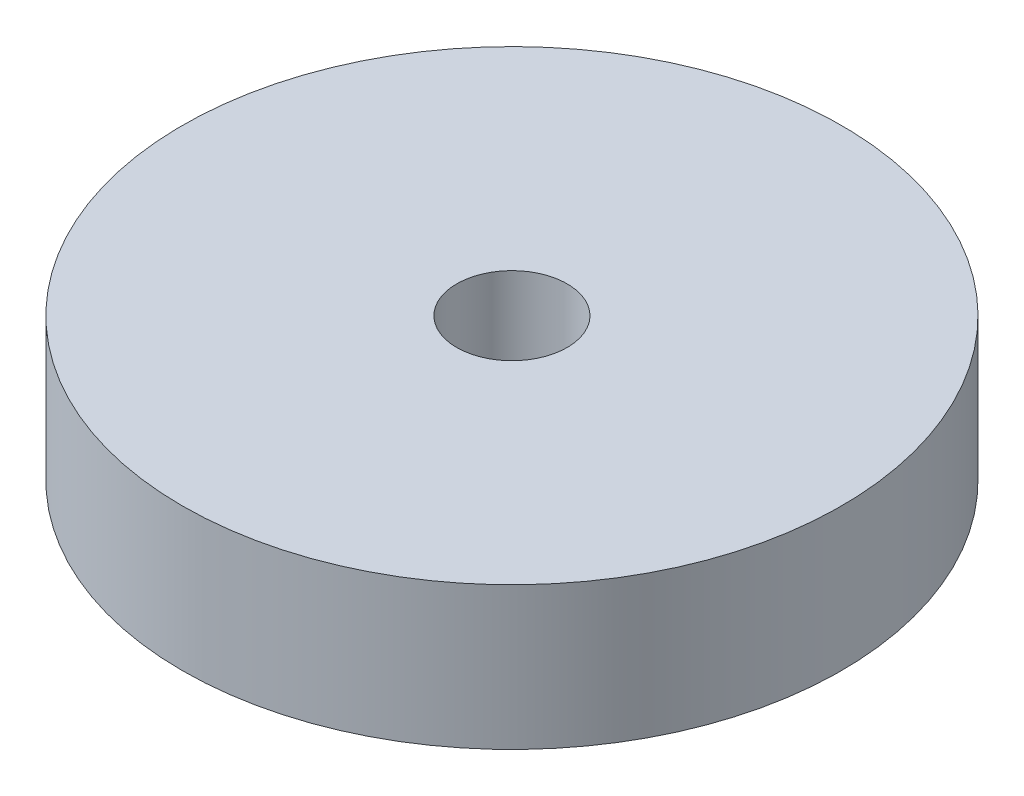
ISO-10303-21;
HEADER;
FILE_DESCRIPTION(('STEP AP214'),'2;1');
FILE_NAME('part.step','',(''),(''),'','','');
FILE_SCHEMA(('AUTOMOTIVE_DESIGN { 1 0 10303 214 1 1 1 1 }'));
ENDSEC;
DATA;
#1=APPLICATION_CONTEXT('core data for automotive mechanical design processes');
#2=APPLICATION_PROTOCOL_DEFINITION('international standard','automotive_design',2000,#1);
#3=PRODUCT_CONTEXT('',#1,'mechanical');
#4=PRODUCT('Part','Part','',(#3));
#5=PRODUCT_RELATED_PRODUCT_CATEGORY('part','',(#4));
#6=PRODUCT_DEFINITION_FORMATION('','',#4);
#7=PRODUCT_DEFINITION_CONTEXT('part definition',#1,'design');
#8=PRODUCT_DEFINITION('design','',#6,#7);
#9=PRODUCT_DEFINITION_SHAPE('','',#8);
#10=(LENGTH_UNIT() NAMED_UNIT(*) SI_UNIT(.MILLI.,.METRE.));
#11=(NAMED_UNIT(*) PLANE_ANGLE_UNIT() SI_UNIT($,.RADIAN.));
#12=(NAMED_UNIT(*) SI_UNIT($,.STERADIAN.) SOLID_ANGLE_UNIT());
#13=UNCERTAINTY_MEASURE_WITH_UNIT(LENGTH_MEASURE(1.E-05),#10,'distance_accuracy_value','');
#14=(GEOMETRIC_REPRESENTATION_CONTEXT(3) GLOBAL_UNCERTAINTY_ASSIGNED_CONTEXT((#13)) GLOBAL_UNIT_ASSIGNED_CONTEXT((#10,
#11,#12)) REPRESENTATION_CONTEXT('',''));
#15=CARTESIAN_POINT('',(0.,0.,0.));
#16=DIRECTION('',(0.,0.,1.));
#17=DIRECTION('',(1.,0.,0.));
#18=AXIS2_PLACEMENT_3D('',#15,#16,#17);
#19=CARTESIAN_POINT('',(14.6685,0.,0.));
#20=DIRECTION('',(0.,1.,0.));
#21=DIRECTION('',(0.,0.,1.));
#22=AXIS2_PLACEMENT_3D('',#19,#20,#21);
#23=PLANE('',#22);
#24=CARTESIAN_POINT('',(0.,0.,0.));
#25=DIRECTION('',(0.,1.,0.));
#26=DIRECTION('',(0.,0.,1.));
#27=AXIS2_PLACEMENT_3D('',#24,#25,#26);
#28=CIRCLE('',#27,2.45745);
#29=CARTESIAN_POINT('',(0.,0.,2.45745));
#30=VERTEX_POINT('',#29);
#31=EDGE_CURVE('E40',#30,#30,#28,.T.);
#32=ORIENTED_EDGE('',*,*,#31,.T.);
#33=EDGE_LOOP('',(#32));
#34=FACE_BOUND('',#33,.T.);
#35=CARTESIAN_POINT('',(0.,0.,0.));
#36=DIRECTION('',(0.,1.,0.));
#37=DIRECTION('',(0.,0.,1.));
#38=AXIS2_PLACEMENT_3D('',#35,#36,#37);
#39=CIRCLE('',#38,14.6685);
#40=CARTESIAN_POINT('',(0.,0.,14.6685));
#41=VERTEX_POINT('',#40);
#42=EDGE_CURVE('E10',#41,#41,#39,.T.);
#43=ORIENTED_EDGE('',*,*,#42,.F.);
#44=EDGE_LOOP('',(#43));
#45=FACE_BOUND('',#44,.T.);
#46=ADVANCED_FACE('F30',(#34,#45),#23,.F.);
#47=CARTESIAN_POINT('',(0.,93.7602273504644,0.));
#48=DIRECTION('',(0.,1.,0.));
#49=DIRECTION('',(0.,0.,1.));
#50=AXIS2_PLACEMENT_3D('',#47,#48,#49);
#51=CYLINDRICAL_SURFACE('',#50,14.6685);
#52=CARTESIAN_POINT('',(0.,6.34999999999999,0.));
#53=DIRECTION('',(0.,1.,0.));
#54=DIRECTION('',(0.,0.,1.));
#55=AXIS2_PLACEMENT_3D('',#52,#53,#54);
#56=CIRCLE('',#55,14.6685);
#57=CARTESIAN_POINT('',(0.,6.34999999999999,14.6685));
#58=VERTEX_POINT('',#57);
#59=EDGE_CURVE('E36',#58,#58,#56,.T.);
#60=ORIENTED_EDGE('',*,*,#59,.F.);
#61=EDGE_LOOP('',(#60));
#62=FACE_BOUND('',#61,.T.);
#63=ORIENTED_EDGE('',*,*,#42,.T.);
#64=EDGE_LOOP('',(#63));
#65=FACE_BOUND('',#64,.T.);
#66=ADVANCED_FACE('F54',(#62,#65),#51,.T.);
#67=CARTESIAN_POINT('',(14.6685,6.35,0.));
#68=DIRECTION('',(0.,-1.,0.));
#69=DIRECTION('',(0.,0.,-1.));
#70=AXIS2_PLACEMENT_3D('',#67,#68,#69);
#71=PLANE('',#70);
#72=CARTESIAN_POINT('',(0.,6.35,0.));
#73=DIRECTION('',(0.,1.,0.));
#74=DIRECTION('',(0.,0.,1.));
#75=AXIS2_PLACEMENT_3D('',#72,#73,#74);
#76=CIRCLE('',#75,2.45744999999999);
#77=CARTESIAN_POINT('',(0.,6.35,2.45744999999999));
#78=VERTEX_POINT('',#77);
#79=EDGE_CURVE('E44',#78,#78,#76,.T.);
#80=ORIENTED_EDGE('',*,*,#79,.F.);
#81=EDGE_LOOP('',(#80));
#82=FACE_BOUND('',#81,.T.);
#83=ORIENTED_EDGE('',*,*,#59,.T.);
#84=EDGE_LOOP('',(#83));
#85=FACE_BOUND('',#84,.T.);
#86=ADVANCED_FACE('F52',(#82,#85),#71,.F.);
#87=CARTESIAN_POINT('',(0.,6.35,0.));
#88=DIRECTION('',(0.,1.,0.));
#89=DIRECTION('',(0.,0.,1.));
#90=AXIS2_PLACEMENT_3D('',#87,#88,#89);
#91=CYLINDRICAL_SURFACE('',#90,2.45744999999999);
#92=ORIENTED_EDGE('',*,*,#31,.F.);
#93=EDGE_LOOP('',(#92));
#94=FACE_BOUND('',#93,.T.);
#95=ORIENTED_EDGE('',*,*,#79,.T.);
#96=EDGE_LOOP('',(#95));
#97=FACE_BOUND('',#96,.T.);
#98=ADVANCED_FACE('F50',(#94,#97),#91,.F.);
#99=CLOSED_SHELL('',(#46,#66,#86,#98));
#100=MANIFOLD_SOLID_BREP('B2',#99);
#101=ADVANCED_BREP_SHAPE_REPRESENTATION('',(#18,#100),#14);
#102=SHAPE_DEFINITION_REPRESENTATION(#9,#101);
ENDSEC;
END-ISO-10303-21;
